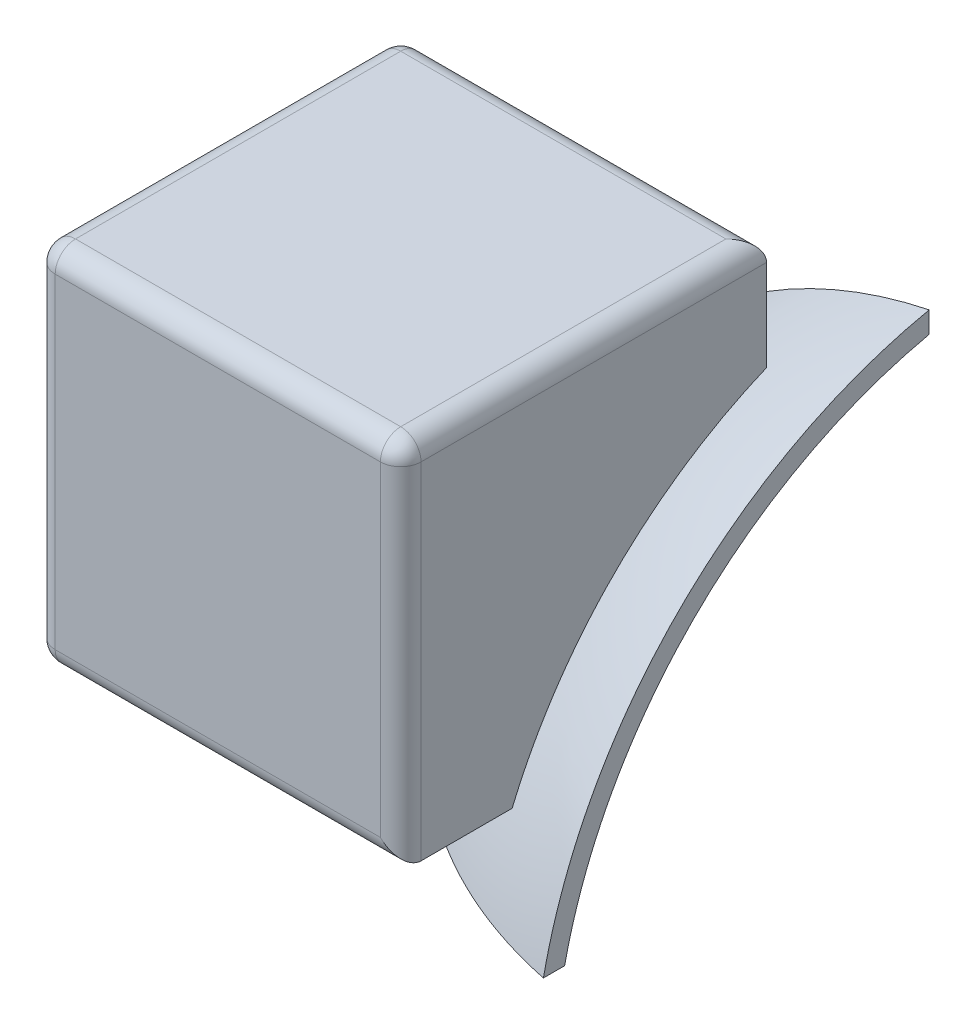
ISO-10303-21;
HEADER;
FILE_DESCRIPTION(('STEP AP214'),'2;1');
FILE_NAME('part.step','',(''),(''),'','','');
FILE_SCHEMA(('AUTOMOTIVE_DESIGN { 1 0 10303 214 1 1 1 1 }'));
ENDSEC;
DATA;
#1=APPLICATION_CONTEXT('core data for automotive mechanical design processes');
#2=APPLICATION_PROTOCOL_DEFINITION('international standard','automotive_design',2000,#1);
#3=PRODUCT_CONTEXT('',#1,'mechanical');
#4=PRODUCT('Part','Part','',(#3));
#5=PRODUCT_RELATED_PRODUCT_CATEGORY('part','',(#4));
#6=PRODUCT_DEFINITION_FORMATION('','',#4);
#7=PRODUCT_DEFINITION_CONTEXT('part definition',#1,'design');
#8=PRODUCT_DEFINITION('design','',#6,#7);
#9=PRODUCT_DEFINITION_SHAPE('','',#8);
#10=(LENGTH_UNIT() NAMED_UNIT(*) SI_UNIT(.MILLI.,.METRE.));
#11=(NAMED_UNIT(*) PLANE_ANGLE_UNIT() SI_UNIT($,.RADIAN.));
#12=(NAMED_UNIT(*) SI_UNIT($,.STERADIAN.) SOLID_ANGLE_UNIT());
#13=UNCERTAINTY_MEASURE_WITH_UNIT(LENGTH_MEASURE(1.E-05),#10,'distance_accuracy_value','');
#14=(GEOMETRIC_REPRESENTATION_CONTEXT(3) GLOBAL_UNCERTAINTY_ASSIGNED_CONTEXT((#13)) GLOBAL_UNIT_ASSIGNED_CONTEXT((#10,
#11,#12)) REPRESENTATION_CONTEXT('',''));
#15=CARTESIAN_POINT('',(0.,0.,0.));
#16=DIRECTION('',(0.,0.,1.));
#17=DIRECTION('',(1.,0.,0.));
#18=AXIS2_PLACEMENT_3D('',#15,#16,#17);
#19=CARTESIAN_POINT('',(0.,0.,0.));
#20=DIRECTION('',(0.,0.,1.));
#21=DIRECTION('',(0.,-1.,0.));
#22=AXIS2_PLACEMENT_3D('',#19,#20,#21);
#23=SPHERICAL_SURFACE('',#22,50.);
#24=CARTESIAN_POINT('',(-10.4166666666667,0.,0.));
#25=DIRECTION('',(1.,0.,0.));
#26=DIRECTION('',(0.,0.,-1.));
#27=AXIS2_PLACEMENT_3D('',#24,#25,#26);
#28=CIRCLE('',#27,48.9028941429396);
#29=CARTESIAN_POINT('',(-10.4166666666667,10.4166666666667,47.7806039215822));
#30=VERTEX_POINT('',#29);
#31=CARTESIAN_POINT('',(-10.4166666666667,47.7806039215822,10.4166666666667));
#32=VERTEX_POINT('',#31);
#33=EDGE_CURVE('E80',#30,#32,#28,.F.);
#34=ORIENTED_EDGE('',*,*,#33,.F.);
#35=CARTESIAN_POINT('',(0.,10.4166666666667,0.));
#36=DIRECTION('',(0.,-1.,0.));
#37=DIRECTION('',(0.,0.,-1.));
#38=AXIS2_PLACEMENT_3D('',#35,#36,#37);
#39=CIRCLE('',#38,48.9028941429396);
#40=CARTESIAN_POINT('',(-47.7806039215822,10.4166666666667,10.4166666666667));
#41=VERTEX_POINT('',#40);
#42=EDGE_CURVE('E87',#41,#30,#39,.F.);
#43=ORIENTED_EDGE('',*,*,#42,.F.);
#44=CARTESIAN_POINT('',(0.,0.,10.4166666666667));
#45=DIRECTION('',(0.,0.,1.));
#46=DIRECTION('',(1.,0.,0.));
#47=AXIS2_PLACEMENT_3D('',#44,#45,#46);
#48=CIRCLE('',#47,48.9028941429396);
#49=EDGE_CURVE('E89',#41,#32,#48,.F.);
#50=ORIENTED_EDGE('',*,*,#49,.T.);
#51=EDGE_LOOP('',(#34,#43,#50));
#52=FACE_BOUND('',#51,.T.);
#53=ADVANCED_FACE('F46',(#52),#23,.F.);
#54=CARTESIAN_POINT('',(0.,0.,0.));
#55=DIRECTION('',(0.,0.,1.));
#56=DIRECTION('',(0.,1.,0.));
#57=AXIS2_PLACEMENT_3D('',#54,#55,#56);
#58=SPHERICAL_SURFACE('',#57,52.0833333333333);
#59=CARTESIAN_POINT('',(-10.4166666666667,0.,0.));
#60=DIRECTION('',(1.,0.,0.));
#61=DIRECTION('',(0.,0.,-1.));
#62=AXIS2_PLACEMENT_3D('',#59,#60,#61);
#63=CIRCLE('',#62,51.0310363079829);
#64=CARTESIAN_POINT('',(-10.4166666666667,49.9565783678408,10.4166666666667));
#65=VERTEX_POINT('',#64);
#66=CARTESIAN_POINT('',(-10.4166666666667,10.4166666666667,49.9565783678408));
#67=VERTEX_POINT('',#66);
#68=EDGE_CURVE('E61',#65,#67,#63,.T.);
#69=ORIENTED_EDGE('',*,*,#68,.F.);
#70=CARTESIAN_POINT('',(0.,0.,10.4166666666667));
#71=DIRECTION('',(0.,0.,1.));
#72=DIRECTION('',(1.,0.,0.));
#73=AXIS2_PLACEMENT_3D('',#70,#71,#72);
#74=CIRCLE('',#73,51.0310363079829);
#75=CARTESIAN_POINT('',(-49.9565783678408,10.4166666666667,10.4166666666667));
#76=VERTEX_POINT('',#75);
#77=EDGE_CURVE('E67',#65,#76,#74,.T.);
#78=ORIENTED_EDGE('',*,*,#77,.T.);
#79=CARTESIAN_POINT('',(0.,10.4166666666667,0.));
#80=DIRECTION('',(0.,-1.,0.));
#81=DIRECTION('',(0.,0.,-1.));
#82=AXIS2_PLACEMENT_3D('',#79,#80,#81);
#83=CIRCLE('',#82,51.0310363079829);
#84=EDGE_CURVE('E94',#67,#76,#83,.T.);
#85=ORIENTED_EDGE('',*,*,#84,.F.);
#86=EDGE_LOOP('',(#69,#78,#85));
#87=FACE_BOUND('',#86,.T.);
#88=ADVANCED_FACE('F48',(#87),#58,.T.);
#89=CARTESIAN_POINT('',(0.,0.,10.4166666666667));
#90=DIRECTION('',(0.,0.,1.));
#91=DIRECTION('',(1.,0.,0.));
#92=AXIS2_PLACEMENT_3D('',#89,#90,#91);
#93=PLANE('',#92);
#94=DIRECTION('',(0.,1.,0.));
#95=VECTOR('',#94,1.);
#96=CARTESIAN_POINT('',(-10.4166666666667,0.,10.4166666666667));
#97=LINE('',#96,#95);
#98=EDGE_CURVE('E90',#32,#65,#97,.T.);
#99=ORIENTED_EDGE('',*,*,#98,.F.);
#100=ORIENTED_EDGE('',*,*,#49,.F.);
#101=DIRECTION('',(1.,0.,0.));
#102=VECTOR('',#101,1.);
#103=CARTESIAN_POINT('',(0.,10.4166666666667,10.4166666666667));
#104=LINE('',#103,#102);
#105=EDGE_CURVE('E54',#76,#41,#104,.T.);
#106=ORIENTED_EDGE('',*,*,#105,.F.);
#107=ORIENTED_EDGE('',*,*,#77,.F.);
#108=EDGE_LOOP('',(#99,#100,#106,#107));
#109=FACE_BOUND('',#108,.T.);
#110=ADVANCED_FACE('F102',(#109),#93,.F.);
#111=CARTESIAN_POINT('',(0.,10.4166666666667,0.));
#112=DIRECTION('',(0.,-1.,0.));
#113=DIRECTION('',(0.,0.,-1.));
#114=AXIS2_PLACEMENT_3D('',#111,#112,#113);
#115=PLANE('',#114);
#116=ORIENTED_EDGE('',*,*,#42,.T.);
#117=DIRECTION('',(0.,0.,1.));
#118=VECTOR('',#117,1.);
#119=CARTESIAN_POINT('',(-10.4166666666667,10.4166666666667,0.));
#120=LINE('',#119,#118);
#121=EDGE_CURVE('E12',#30,#67,#120,.T.);
#122=ORIENTED_EDGE('',*,*,#121,.T.);
#123=ORIENTED_EDGE('',*,*,#84,.T.);
#124=ORIENTED_EDGE('',*,*,#105,.T.);
#125=EDGE_LOOP('',(#116,#122,#123,#124));
#126=FACE_BOUND('',#125,.T.);
#127=ADVANCED_FACE('F92',(#126),#115,.T.);
#128=CARTESIAN_POINT('',(-10.4166666666667,0.,0.));
#129=DIRECTION('',(1.,0.,0.));
#130=DIRECTION('',(0.,0.,-1.));
#131=AXIS2_PLACEMENT_3D('',#128,#129,#130);
#132=PLANE('',#131);
#133=ORIENTED_EDGE('',*,*,#98,.T.);
#134=ORIENTED_EDGE('',*,*,#68,.T.);
#135=ORIENTED_EDGE('',*,*,#121,.F.);
#136=ORIENTED_EDGE('',*,*,#33,.T.);
#137=EDGE_LOOP('',(#133,#134,#135,#136));
#138=FACE_BOUND('',#137,.T.);
#139=ADVANCED_FACE('F79',(#138),#132,.T.);
#140=CLOSED_SHELL('',(#53,#88,#110,#127,#139));
#141=MANIFOLD_SOLID_BREP('B2',#140);
#142=CARTESIAN_POINT('',(-56.25,56.25,-56.25));
#143=DIRECTION('',(1.,0.,0.));
#144=DIRECTION('',(0.,0.,-1.));
#145=AXIS2_PLACEMENT_3D('',#142,#143,#144);
#146=PLANE('',#145);
#147=DIRECTION('',(0.,0.,-1.));
#148=VECTOR('',#147,1.);
#149=CARTESIAN_POINT('',(-56.25,20.8333333333333,-56.25));
#150=LINE('',#149,#148);
#151=CARTESIAN_POINT('',(-56.25,20.8333333333333,20.8333333333333));
#152=VERTEX_POINT('',#151);
#153=CARTESIAN_POINT('',(-56.25,20.8333333333333,54.1666666666667));
#154=VERTEX_POINT('',#153);
#155=EDGE_CURVE('E257',#152,#154,#150,.F.);
#156=ORIENTED_EDGE('',*,*,#155,.T.);
#157=DIRECTION('',(0.,-1.,0.));
#158=VECTOR('',#157,1.);
#159=CARTESIAN_POINT('',(-56.25,56.25,54.1666666666667));
#160=LINE('',#159,#158);
#161=CARTESIAN_POINT('',(-56.25,54.1666666666667,54.1666666666667));
#162=VERTEX_POINT('',#161);
#163=EDGE_CURVE('E259',#154,#162,#160,.F.);
#164=ORIENTED_EDGE('',*,*,#163,.T.);
#165=DIRECTION('',(0.,0.,1.));
#166=VECTOR('',#165,1.);
#167=CARTESIAN_POINT('',(-56.25,54.1666666666667,18.75));
#168=LINE('',#167,#166);
#169=CARTESIAN_POINT('',(-56.25,54.1666666666667,20.8333333333333));
#170=VERTEX_POINT('',#169);
#171=EDGE_CURVE('E253',#162,#170,#168,.F.);
#172=ORIENTED_EDGE('',*,*,#171,.T.);
#173=DIRECTION('',(0.,1.,0.));
#174=VECTOR('',#173,1.);
#175=CARTESIAN_POINT('',(-56.25,56.25,20.8333333333333));
#176=LINE('',#175,#174);
#177=EDGE_CURVE('E255',#170,#152,#176,.F.);
#178=ORIENTED_EDGE('',*,*,#177,.T.);
#179=EDGE_LOOP('',(#156,#164,#172,#178));
#180=FACE_BOUND('',#179,.T.);
#181=ADVANCED_FACE('F143',(#180),#146,.F.);
#182=CARTESIAN_POINT('',(-56.25,56.25,56.25));
#183=DIRECTION('',(0.,0.,-1.));
#184=DIRECTION('',(-1.,0.,0.));
#185=AXIS2_PLACEMENT_3D('',#182,#183,#184);
#186=PLANE('',#185);
#187=DIRECTION('',(1.,0.,0.));
#188=VECTOR('',#187,1.);
#189=CARTESIAN_POINT('',(-56.25,54.1666666666667,56.25));
#190=LINE('',#189,#188);
#191=CARTESIAN_POINT('',(-20.8333333333333,54.1666666666667,56.25));
#192=VERTEX_POINT('',#191);
#193=CARTESIAN_POINT('',(-54.1666666666667,54.1666666666667,56.25));
#194=VERTEX_POINT('',#193);
#195=EDGE_CURVE('E248',#192,#194,#190,.F.);
#196=ORIENTED_EDGE('',*,*,#195,.T.);
#197=DIRECTION('',(0.,-1.,0.));
#198=VECTOR('',#197,1.);
#199=CARTESIAN_POINT('',(-54.1666666666667,56.25,56.25));
#200=LINE('',#199,#198);
#201=CARTESIAN_POINT('',(-54.1666666666667,20.8333333333333,56.25));
#202=VERTEX_POINT('',#201);
#203=EDGE_CURVE('E250',#194,#202,#200,.T.);
#204=ORIENTED_EDGE('',*,*,#203,.T.);
#205=DIRECTION('',(-1.,0.,0.));
#206=VECTOR('',#205,1.);
#207=CARTESIAN_POINT('',(-56.25,20.8333333333333,56.25));
#208=LINE('',#207,#206);
#209=CARTESIAN_POINT('',(-20.8333333333333,20.8333333333333,56.25));
#210=VERTEX_POINT('',#209);
#211=EDGE_CURVE('E244',#202,#210,#208,.F.);
#212=ORIENTED_EDGE('',*,*,#211,.T.);
#213=DIRECTION('',(0.,1.,0.));
#214=VECTOR('',#213,1.);
#215=CARTESIAN_POINT('',(-20.8333333333333,56.25,56.25));
#216=LINE('',#215,#214);
#217=EDGE_CURVE('E246',#210,#192,#216,.T.);
#218=ORIENTED_EDGE('',*,*,#217,.T.);
#219=EDGE_LOOP('',(#196,#204,#212,#218));
#220=FACE_BOUND('',#219,.T.);
#221=ADVANCED_FACE('F384',(#220),#186,.F.);
#222=CARTESIAN_POINT('',(0.,56.25,0.));
#223=DIRECTION('',(0.,1.,0.));
#224=DIRECTION('',(0.,0.,1.));
#225=AXIS2_PLACEMENT_3D('',#222,#223,#224);
#226=PLANE('',#225);
#227=DIRECTION('',(1.,0.,0.));
#228=VECTOR('',#227,1.);
#229=CARTESIAN_POINT('',(-18.75,56.25,54.1666666666667));
#230=LINE('',#229,#228);
#231=CARTESIAN_POINT('',(-54.1666666666667,56.25,54.1666666666667));
#232=VERTEX_POINT('',#231);
#233=CARTESIAN_POINT('',(-20.8333333333333,56.25,54.1666666666667));
#234=VERTEX_POINT('',#233);
#235=EDGE_CURVE('E266',#232,#234,#230,.T.);
#236=ORIENTED_EDGE('',*,*,#235,.T.);
#237=DIRECTION('',(0.,0.,1.));
#238=VECTOR('',#237,1.);
#239=CARTESIAN_POINT('',(-20.8333333333333,56.25,18.75));
#240=LINE('',#239,#238);
#241=CARTESIAN_POINT('',(-20.8333333333333,56.25,20.8333333333333));
#242=VERTEX_POINT('',#241);
#243=EDGE_CURVE('E269',#234,#242,#240,.F.);
#244=ORIENTED_EDGE('',*,*,#243,.T.);
#245=DIRECTION('',(-1.,0.,0.));
#246=VECTOR('',#245,1.);
#247=CARTESIAN_POINT('',(-56.25,56.25,20.8333333333333));
#248=LINE('',#247,#246);
#249=CARTESIAN_POINT('',(-54.1666666666667,56.25,20.8333333333333));
#250=VERTEX_POINT('',#249);
#251=EDGE_CURVE('E264',#242,#250,#248,.T.);
#252=ORIENTED_EDGE('',*,*,#251,.T.);
#253=DIRECTION('',(0.,0.,1.));
#254=VECTOR('',#253,1.);
#255=CARTESIAN_POINT('',(-54.1666666666667,56.25,56.25));
#256=LINE('',#255,#254);
#257=EDGE_CURVE('E262',#250,#232,#256,.T.);
#258=ORIENTED_EDGE('',*,*,#257,.T.);
#259=EDGE_LOOP('',(#236,#244,#252,#258));
#260=FACE_BOUND('',#259,.T.);
#261=ADVANCED_FACE('F343',(#260),#226,.T.);
#262=CARTESIAN_POINT('',(56.25,56.25,18.75));
#263=DIRECTION('',(0.,0.,1.));
#264=DIRECTION('',(0.,-1.,0.));
#265=AXIS2_PLACEMENT_3D('',#262,#263,#264);
#266=PLANE('',#265);
#267=CARTESIAN_POINT('',(0.,0.,18.75));
#268=DIRECTION('',(0.,0.,1.));
#269=DIRECTION('',(0.,-1.,0.));
#270=AXIS2_PLACEMENT_3D('',#267,#268,#269);
#271=CIRCLE('',#270,48.5912657903775);
#272=CARTESIAN_POINT('',(-44.8279891486459,18.75,18.75));
#273=VERTEX_POINT('',#272);
#274=CARTESIAN_POINT('',(-18.75,44.8279891486459,18.75));
#275=VERTEX_POINT('',#274);
#276=EDGE_CURVE('E157',#273,#275,#271,.F.);
#277=ORIENTED_EDGE('',*,*,#276,.F.);
#278=DIRECTION('',(-1.,0.,0.));
#279=VECTOR('',#278,1.);
#280=CARTESIAN_POINT('',(56.25,18.75,18.75));
#281=LINE('',#280,#279);
#282=CARTESIAN_POINT('',(-54.1666666666667,18.75,18.75));
#283=VERTEX_POINT('',#282);
#284=EDGE_CURVE('E229',#273,#283,#281,.T.);
#285=ORIENTED_EDGE('',*,*,#284,.T.);
#286=DIRECTION('',(0.,1.,0.));
#287=VECTOR('',#286,1.);
#288=CARTESIAN_POINT('',(-54.1666666666667,56.25,18.75));
#289=LINE('',#288,#287);
#290=CARTESIAN_POINT('',(-54.1666666666667,54.1666666666667,18.75));
#291=VERTEX_POINT('',#290);
#292=EDGE_CURVE('E271',#283,#291,#289,.T.);
#293=ORIENTED_EDGE('',*,*,#292,.T.);
#294=DIRECTION('',(-1.,0.,0.));
#295=VECTOR('',#294,1.);
#296=CARTESIAN_POINT('',(-18.75,54.1666666666667,18.75));
#297=LINE('',#296,#295);
#298=CARTESIAN_POINT('',(-18.75,54.1666666666667,18.75));
#299=VERTEX_POINT('',#298);
#300=EDGE_CURVE('E273',#291,#299,#297,.F.);
#301=ORIENTED_EDGE('',*,*,#300,.T.);
#302=DIRECTION('',(0.,1.,0.));
#303=VECTOR('',#302,1.);
#304=CARTESIAN_POINT('',(-18.75,18.75,18.75));
#305=LINE('',#304,#303);
#306=EDGE_CURVE('E235',#275,#299,#305,.T.);
#307=ORIENTED_EDGE('',*,*,#306,.F.);
#308=EDGE_LOOP('',(#277,#285,#293,#301,#307));
#309=FACE_BOUND('',#308,.T.);
#310=ADVANCED_FACE('F360',(#309),#266,.F.);
#311=CARTESIAN_POINT('',(56.25,18.75,56.25));
#312=DIRECTION('',(0.,1.,0.));
#313=DIRECTION('',(0.,0.,1.));
#314=AXIS2_PLACEMENT_3D('',#311,#312,#313);
#315=PLANE('',#314);
#316=CARTESIAN_POINT('',(0.,18.75,0.));
#317=DIRECTION('',(0.,1.,0.));
#318=DIRECTION('',(0.,0.,1.));
#319=AXIS2_PLACEMENT_3D('',#316,#317,#318);
#320=CIRCLE('',#319,48.5912657903775);
#321=CARTESIAN_POINT('',(-18.75,18.75,44.8279891486459));
#322=VERTEX_POINT('',#321);
#323=EDGE_CURVE('E221',#322,#273,#320,.F.);
#324=ORIENTED_EDGE('',*,*,#323,.F.);
#325=DIRECTION('',(0.,0.,1.));
#326=VECTOR('',#325,1.);
#327=CARTESIAN_POINT('',(-18.75,18.75,18.75));
#328=LINE('',#327,#326);
#329=CARTESIAN_POINT('',(-18.75,18.75,54.1666666666667));
#330=VERTEX_POINT('',#329);
#331=EDGE_CURVE('E227',#322,#330,#328,.T.);
#332=ORIENTED_EDGE('',*,*,#331,.T.);
#333=DIRECTION('',(-1.,0.,0.));
#334=VECTOR('',#333,1.);
#335=CARTESIAN_POINT('',(56.25,18.75,54.1666666666667));
#336=LINE('',#335,#334);
#337=CARTESIAN_POINT('',(-54.1666666666667,18.75,54.1666666666667));
#338=VERTEX_POINT('',#337);
#339=EDGE_CURVE('E151',#330,#338,#336,.T.);
#340=ORIENTED_EDGE('',*,*,#339,.T.);
#341=DIRECTION('',(0.,0.,-1.));
#342=VECTOR('',#341,1.);
#343=CARTESIAN_POINT('',(-54.1666666666667,18.75,56.25));
#344=LINE('',#343,#342);
#345=EDGE_CURVE('E279',#338,#283,#344,.T.);
#346=ORIENTED_EDGE('',*,*,#345,.T.);
#347=ORIENTED_EDGE('',*,*,#284,.F.);
#348=EDGE_LOOP('',(#324,#332,#340,#346,#347));
#349=FACE_BOUND('',#348,.T.);
#350=ADVANCED_FACE('F226',(#349),#315,.F.);
#351=CARTESIAN_POINT('',(-18.75,18.75,18.75));
#352=DIRECTION('',(-1.,0.,0.));
#353=DIRECTION('',(0.,0.,1.));
#354=AXIS2_PLACEMENT_3D('',#351,#352,#353);
#355=PLANE('',#354);
#356=CARTESIAN_POINT('',(-18.75,0.,0.));
#357=DIRECTION('',(-1.,0.,0.));
#358=DIRECTION('',(0.,0.,1.));
#359=AXIS2_PLACEMENT_3D('',#356,#357,#358);
#360=CIRCLE('',#359,48.5912657903775);
#361=EDGE_CURVE('E44',#275,#322,#360,.F.);
#362=ORIENTED_EDGE('',*,*,#361,.F.);
#363=ORIENTED_EDGE('',*,*,#306,.T.);
#364=DIRECTION('',(0.,0.,1.));
#365=VECTOR('',#364,1.);
#366=CARTESIAN_POINT('',(-18.75,54.1666666666667,56.25));
#367=LINE('',#366,#365);
#368=CARTESIAN_POINT('',(-18.75,54.1666666666667,54.1666666666667));
#369=VERTEX_POINT('',#368);
#370=EDGE_CURVE('E277',#299,#369,#367,.T.);
#371=ORIENTED_EDGE('',*,*,#370,.T.);
#372=DIRECTION('',(0.,1.,0.));
#373=VECTOR('',#372,1.);
#374=CARTESIAN_POINT('',(-18.75,18.75,54.1666666666667));
#375=LINE('',#374,#373);
#376=EDGE_CURVE('E233',#369,#330,#375,.F.);
#377=ORIENTED_EDGE('',*,*,#376,.T.);
#378=ORIENTED_EDGE('',*,*,#331,.F.);
#379=EDGE_LOOP('',(#362,#363,#371,#377,#378));
#380=FACE_BOUND('',#379,.T.);
#381=ADVANCED_FACE('F231',(#380),#355,.F.);
#382=CARTESIAN_POINT('',(0.,54.1666666666667,20.8333333333333));
#383=DIRECTION('',(1.,0.,0.));
#384=DIRECTION('',(0.,0.,-1.));
#385=AXIS2_PLACEMENT_3D('',#382,#383,#384);
#386=CYLINDRICAL_SURFACE('',#385,2.08333333333333);
#387=CARTESIAN_POINT('',(-54.1666666666667,54.1666666666667,20.8333333333333));
#388=DIRECTION('',(-1.,0.,0.));
#389=DIRECTION('',(0.,0.,1.));
#390=AXIS2_PLACEMENT_3D('',#387,#388,#389);
#391=CIRCLE('',#390,2.08333333333333);
#392=EDGE_CURVE('E240',#250,#291,#391,.T.);
#393=ORIENTED_EDGE('',*,*,#392,.F.);
#394=ORIENTED_EDGE('',*,*,#251,.F.);
#395=CARTESIAN_POINT('',(-20.8333333333333,54.1666666666667,20.8333333333333));
#396=DIRECTION('',(-0.707106781186548,0.,-0.707106781186547));
#397=DIRECTION('',(0.707106781186547,0.,-0.707106781186548));
#398=AXIS2_PLACEMENT_3D('',#395,#396,#397);
#399=ELLIPSE('',#398,2.94627825494395,2.08333333333333);
#400=EDGE_CURVE('E236',#299,#242,#399,.F.);
#401=ORIENTED_EDGE('',*,*,#400,.F.);
#402=ORIENTED_EDGE('',*,*,#300,.F.);
#403=EDGE_LOOP('',(#393,#394,#401,#402));
#404=FACE_BOUND('',#403,.T.);
#405=ADVANCED_FACE('F145',(#404),#386,.T.);
#406=CARTESIAN_POINT('',(-20.8333333333333,54.1666666666667,18.75));
#407=DIRECTION('',(0.,0.,-1.));
#408=DIRECTION('',(-1.,0.,0.));
#409=AXIS2_PLACEMENT_3D('',#406,#407,#408);
#410=CYLINDRICAL_SURFACE('',#409,2.08333333333333);
#411=ORIENTED_EDGE('',*,*,#400,.T.);
#412=ORIENTED_EDGE('',*,*,#243,.F.);
#413=CARTESIAN_POINT('',(-20.8333333333333,54.1666666666667,54.1666666666667));
#414=DIRECTION('',(0.,0.,1.));
#415=DIRECTION('',(1.,0.,0.));
#416=AXIS2_PLACEMENT_3D('',#413,#414,#415);
#417=CIRCLE('',#416,2.08333333333333);
#418=EDGE_CURVE('E315',#369,#234,#417,.T.);
#419=ORIENTED_EDGE('',*,*,#418,.F.);
#420=ORIENTED_EDGE('',*,*,#370,.F.);
#421=EDGE_LOOP('',(#411,#412,#419,#420));
#422=FACE_BOUND('',#421,.T.);
#423=ADVANCED_FACE('F357',(#422),#410,.T.);
#424=CARTESIAN_POINT('',(-54.1666666666667,54.1666666666667,20.8333333333333));
#425=DIRECTION('',(0.,0.,1.));
#426=DIRECTION('',(1.,0.,0.));
#427=AXIS2_PLACEMENT_3D('',#424,#425,#426);
#428=SPHERICAL_SURFACE('',#427,2.08333333333333);
#429=CARTESIAN_POINT('',(-54.1666666666667,54.1666666666667,20.8333333333333));
#430=DIRECTION('',(0.,0.,-1.));
#431=DIRECTION('',(-1.,0.,0.));
#432=AXIS2_PLACEMENT_3D('',#429,#430,#431);
#433=CIRCLE('',#432,2.08333333333333);
#434=EDGE_CURVE('E306',#250,#170,#433,.F.);
#435=ORIENTED_EDGE('',*,*,#434,.F.);
#436=ORIENTED_EDGE('',*,*,#392,.T.);
#437=CARTESIAN_POINT('',(-54.1666666666667,54.1666666666667,20.8333333333333));
#438=DIRECTION('',(0.,1.,0.));
#439=DIRECTION('',(0.,0.,1.));
#440=AXIS2_PLACEMENT_3D('',#437,#438,#439);
#441=CIRCLE('',#440,2.08333333333333);
#442=EDGE_CURVE('E309',#170,#291,#441,.F.);
#443=ORIENTED_EDGE('',*,*,#442,.F.);
#444=EDGE_LOOP('',(#435,#436,#443));
#445=FACE_BOUND('',#444,.T.);
#446=ADVANCED_FACE('F323',(#445),#428,.T.);
#447=CARTESIAN_POINT('',(-20.8333333333333,54.1666666666667,54.1666666666667));
#448=DIRECTION('',(0.,0.,1.));
#449=DIRECTION('',(1.,0.,0.));
#450=AXIS2_PLACEMENT_3D('',#447,#448,#449);
#451=SPHERICAL_SURFACE('',#450,2.08333333333333);
#452=CARTESIAN_POINT('',(-20.8333333333333,54.1666666666667,54.1666666666667));
#453=DIRECTION('',(1.,0.,0.));
#454=DIRECTION('',(0.,0.,-1.));
#455=AXIS2_PLACEMENT_3D('',#452,#453,#454);
#456=CIRCLE('',#455,2.08333333333333);
#457=EDGE_CURVE('E304',#192,#234,#456,.F.);
#458=ORIENTED_EDGE('',*,*,#457,.F.);
#459=CARTESIAN_POINT('',(-20.8333333333333,54.1666666666667,54.1666666666667));
#460=DIRECTION('',(0.,1.,0.));
#461=DIRECTION('',(0.,0.,1.));
#462=AXIS2_PLACEMENT_3D('',#459,#460,#461);
#463=CIRCLE('',#462,2.08333333333333);
#464=EDGE_CURVE('E312',#369,#192,#463,.F.);
#465=ORIENTED_EDGE('',*,*,#464,.F.);
#466=ORIENTED_EDGE('',*,*,#418,.T.);
#467=EDGE_LOOP('',(#458,#465,#466));
#468=FACE_BOUND('',#467,.T.);
#469=ADVANCED_FACE('F354',(#468),#451,.T.);
#470=CARTESIAN_POINT('',(-20.8333333333333,56.25,54.1666666666667));
#471=DIRECTION('',(0.,1.,0.));
#472=DIRECTION('',(0.,0.,1.));
#473=AXIS2_PLACEMENT_3D('',#470,#471,#472);
#474=CYLINDRICAL_SURFACE('',#473,2.08333333333333);
#475=ORIENTED_EDGE('',*,*,#464,.T.);
#476=ORIENTED_EDGE('',*,*,#217,.F.);
#477=CARTESIAN_POINT('',(-20.8333333333333,20.8333333333333,54.1666666666667));
#478=DIRECTION('',(-0.707106781186547,-0.707106781186547,0.));
#479=DIRECTION('',(-0.707106781186547,0.707106781186547,0.));
#480=AXIS2_PLACEMENT_3D('',#477,#478,#479);
#481=ELLIPSE('',#480,2.94627825494395,2.08333333333333);
#482=EDGE_CURVE('E301',#330,#210,#481,.T.);
#483=ORIENTED_EDGE('',*,*,#482,.F.);
#484=ORIENTED_EDGE('',*,*,#376,.F.);
#485=EDGE_LOOP('',(#475,#476,#483,#484));
#486=FACE_BOUND('',#485,.T.);
#487=ADVANCED_FACE('F445',(#486),#474,.T.);
#488=CARTESIAN_POINT('',(-54.1666666666667,56.25,20.8333333333333));
#489=DIRECTION('',(0.,1.,0.));
#490=DIRECTION('',(0.,0.,1.));
#491=AXIS2_PLACEMENT_3D('',#488,#489,#490);
#492=CYLINDRICAL_SURFACE('',#491,2.08333333333333);
#493=ORIENTED_EDGE('',*,*,#442,.T.);
#494=ORIENTED_EDGE('',*,*,#292,.F.);
#495=CARTESIAN_POINT('',(-54.1666666666667,20.8333333333333,20.8333333333333));
#496=DIRECTION('',(0.,0.707106781186547,-0.707106781186548));
#497=DIRECTION('',(0.,0.707106781186548,0.707106781186547));
#498=AXIS2_PLACEMENT_3D('',#495,#496,#497);
#499=ELLIPSE('',#498,2.94627825494395,2.08333333333333);
#500=EDGE_CURVE('E298',#152,#283,#499,.F.);
#501=ORIENTED_EDGE('',*,*,#500,.F.);
#502=ORIENTED_EDGE('',*,*,#177,.F.);
#503=EDGE_LOOP('',(#493,#494,#501,#502));
#504=FACE_BOUND('',#503,.T.);
#505=ADVANCED_FACE('F331',(#504),#492,.T.);
#506=CARTESIAN_POINT('',(-54.1666666666667,54.1666666666667,0.));
#507=DIRECTION('',(0.,0.,-1.));
#508=DIRECTION('',(-1.,0.,0.));
#509=AXIS2_PLACEMENT_3D('',#506,#507,#508);
#510=CYLINDRICAL_SURFACE('',#509,2.08333333333333);
#511=ORIENTED_EDGE('',*,*,#434,.T.);
#512=ORIENTED_EDGE('',*,*,#171,.F.);
#513=CARTESIAN_POINT('',(-54.1666666666667,54.1666666666667,54.1666666666667));
#514=DIRECTION('',(0.,0.,1.));
#515=DIRECTION('',(1.,0.,0.));
#516=AXIS2_PLACEMENT_3D('',#513,#514,#515);
#517=CIRCLE('',#516,2.08333333333333);
#518=EDGE_CURVE('E295',#232,#162,#517,.T.);
#519=ORIENTED_EDGE('',*,*,#518,.F.);
#520=ORIENTED_EDGE('',*,*,#257,.F.);
#521=EDGE_LOOP('',(#511,#512,#519,#520));
#522=FACE_BOUND('',#521,.T.);
#523=ADVANCED_FACE('F340',(#522),#510,.T.);
#524=CARTESIAN_POINT('',(0.,54.1666666666667,54.1666666666667));
#525=DIRECTION('',(-1.,0.,0.));
#526=DIRECTION('',(0.,0.,1.));
#527=AXIS2_PLACEMENT_3D('',#524,#525,#526);
#528=CYLINDRICAL_SURFACE('',#527,2.08333333333333);
#529=ORIENTED_EDGE('',*,*,#457,.T.);
#530=ORIENTED_EDGE('',*,*,#235,.F.);
#531=CARTESIAN_POINT('',(-54.1666666666667,54.1666666666667,54.1666666666667));
#532=DIRECTION('',(-1.,0.,0.));
#533=DIRECTION('',(0.,0.,1.));
#534=AXIS2_PLACEMENT_3D('',#531,#532,#533);
#535=CIRCLE('',#534,2.08333333333333);
#536=EDGE_CURVE('E292',#194,#232,#535,.T.);
#537=ORIENTED_EDGE('',*,*,#536,.F.);
#538=ORIENTED_EDGE('',*,*,#195,.F.);
#539=EDGE_LOOP('',(#529,#530,#537,#538));
#540=FACE_BOUND('',#539,.T.);
#541=ADVANCED_FACE('F346',(#540),#528,.T.);
#542=CARTESIAN_POINT('',(56.25,20.8333333333333,54.1666666666667));
#543=DIRECTION('',(-1.,0.,0.));
#544=DIRECTION('',(0.,-1.,0.));
#545=AXIS2_PLACEMENT_3D('',#542,#543,#544);
#546=CYLINDRICAL_SURFACE('',#545,2.08333333333333);
#547=ORIENTED_EDGE('',*,*,#482,.T.);
#548=ORIENTED_EDGE('',*,*,#211,.F.);
#549=CARTESIAN_POINT('',(-54.1666666666667,20.8333333333333,54.1666666666667));
#550=DIRECTION('',(-1.,0.,0.));
#551=DIRECTION('',(0.,0.,1.));
#552=AXIS2_PLACEMENT_3D('',#549,#550,#551);
#553=CIRCLE('',#552,2.08333333333333);
#554=EDGE_CURVE('E289',#338,#202,#553,.T.);
#555=ORIENTED_EDGE('',*,*,#554,.F.);
#556=ORIENTED_EDGE('',*,*,#339,.F.);
#557=EDGE_LOOP('',(#547,#548,#555,#556));
#558=FACE_BOUND('',#557,.T.);
#559=ADVANCED_FACE('F366',(#558),#546,.T.);
#560=CARTESIAN_POINT('',(-54.1666666666667,20.8333333333333,56.25));
#561=DIRECTION('',(0.,0.,-1.));
#562=DIRECTION('',(-1.,0.,0.));
#563=AXIS2_PLACEMENT_3D('',#560,#561,#562);
#564=CYLINDRICAL_SURFACE('',#563,2.08333333333333);
#565=ORIENTED_EDGE('',*,*,#500,.T.);
#566=ORIENTED_EDGE('',*,*,#345,.F.);
#567=CARTESIAN_POINT('',(-54.1666666666667,20.8333333333333,54.1666666666667));
#568=DIRECTION('',(0.,0.,1.));
#569=DIRECTION('',(1.,0.,0.));
#570=AXIS2_PLACEMENT_3D('',#567,#568,#569);
#571=CIRCLE('',#570,2.08333333333333);
#572=EDGE_CURVE('E286',#154,#338,#571,.T.);
#573=ORIENTED_EDGE('',*,*,#572,.F.);
#574=ORIENTED_EDGE('',*,*,#155,.F.);
#575=EDGE_LOOP('',(#565,#566,#573,#574));
#576=FACE_BOUND('',#575,.T.);
#577=ADVANCED_FACE('F363',(#576),#564,.T.);
#578=CARTESIAN_POINT('',(-54.1666666666667,54.1666666666667,54.1666666666667));
#579=DIRECTION('',(0.,0.,1.));
#580=DIRECTION('',(1.,0.,0.));
#581=AXIS2_PLACEMENT_3D('',#578,#579,#580);
#582=SPHERICAL_SURFACE('',#581,2.08333333333333);
#583=ORIENTED_EDGE('',*,*,#536,.T.);
#584=ORIENTED_EDGE('',*,*,#518,.T.);
#585=CARTESIAN_POINT('',(-54.1666666666667,54.1666666666667,54.1666666666667));
#586=DIRECTION('',(0.,1.,0.));
#587=DIRECTION('',(0.,0.,1.));
#588=AXIS2_PLACEMENT_3D('',#585,#586,#587);
#589=CIRCLE('',#588,2.08333333333333);
#590=EDGE_CURVE('E284',#194,#162,#589,.F.);
#591=ORIENTED_EDGE('',*,*,#590,.F.);
#592=EDGE_LOOP('',(#583,#584,#591));
#593=FACE_BOUND('',#592,.T.);
#594=ADVANCED_FACE('F374',(#593),#582,.T.);
#595=CARTESIAN_POINT('',(-54.1666666666667,20.8333333333333,54.1666666666667));
#596=DIRECTION('',(0.,0.,1.));
#597=DIRECTION('',(1.,0.,0.));
#598=AXIS2_PLACEMENT_3D('',#595,#596,#597);
#599=SPHERICAL_SURFACE('',#598,2.08333333333333);
#600=ORIENTED_EDGE('',*,*,#572,.T.);
#601=ORIENTED_EDGE('',*,*,#554,.T.);
#602=CARTESIAN_POINT('',(-54.1666666666667,20.8333333333333,54.1666666666667));
#603=DIRECTION('',(0.,-1.,0.));
#604=DIRECTION('',(0.,0.,-1.));
#605=AXIS2_PLACEMENT_3D('',#602,#603,#604);
#606=CIRCLE('',#605,2.08333333333333);
#607=EDGE_CURVE('E282',#154,#202,#606,.F.);
#608=ORIENTED_EDGE('',*,*,#607,.F.);
#609=EDGE_LOOP('',(#600,#601,#608));
#610=FACE_BOUND('',#609,.T.);
#611=ADVANCED_FACE('F369',(#610),#599,.T.);
#612=CARTESIAN_POINT('',(-54.1666666666667,56.25,54.1666666666667));
#613=DIRECTION('',(0.,-1.,0.));
#614=DIRECTION('',(0.,0.,-1.));
#615=AXIS2_PLACEMENT_3D('',#612,#613,#614);
#616=CYLINDRICAL_SURFACE('',#615,2.08333333333333);
#617=ORIENTED_EDGE('',*,*,#590,.T.);
#618=ORIENTED_EDGE('',*,*,#163,.F.);
#619=ORIENTED_EDGE('',*,*,#607,.T.);
#620=ORIENTED_EDGE('',*,*,#203,.F.);
#621=EDGE_LOOP('',(#617,#618,#619,#620));
#622=FACE_BOUND('',#621,.T.);
#623=ADVANCED_FACE('F372',(#622),#616,.T.);
#624=CARTESIAN_POINT('',(0.,0.,0.));
#625=DIRECTION('',(0.,0.,1.));
#626=DIRECTION('',(-1.,0.,0.));
#627=AXIS2_PLACEMENT_3D('',#624,#625,#626);
#628=SPHERICAL_SURFACE('',#627,52.0833333333333);
#629=ORIENTED_EDGE('',*,*,#276,.T.);
#630=ORIENTED_EDGE('',*,*,#361,.T.);
#631=ORIENTED_EDGE('',*,*,#323,.T.);
#632=EDGE_LOOP('',(#629,#630,#631));
#633=FACE_BOUND('',#632,.T.);
#634=ADVANCED_FACE('F220',(#633),#628,.F.);
#635=CLOSED_SHELL('',(#181,#221,#261,#310,#350,#381,#405,#423,#446,#469,#487,#505,#523,#541,
#559,#577,#594,#611,#623,#634));
#636=MANIFOLD_SOLID_BREP('B6',#635);
#637=ADVANCED_BREP_SHAPE_REPRESENTATION('',(#18,#141,#636),#14);
#638=SHAPE_DEFINITION_REPRESENTATION(#9,#637);
ENDSEC;
END-ISO-10303-21;
